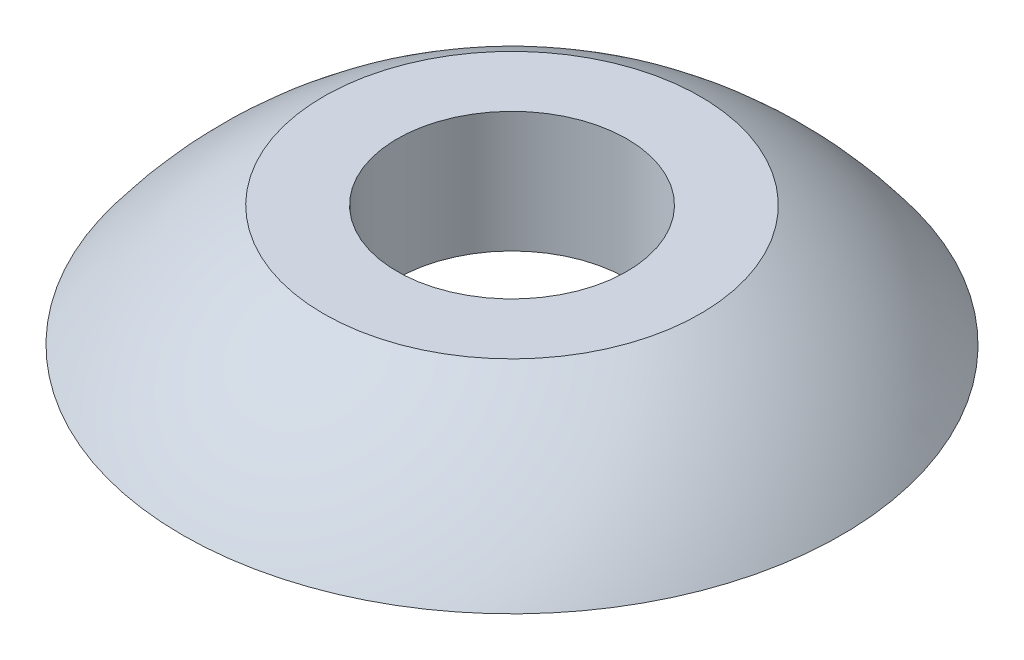
ISO-10303-21;
HEADER;
FILE_DESCRIPTION(('STEP AP214'),'2;1');
FILE_NAME('part.step','',(''),(''),'','','');
FILE_SCHEMA(('AUTOMOTIVE_DESIGN { 1 0 10303 214 1 1 1 1 }'));
ENDSEC;
DATA;
#1=APPLICATION_CONTEXT('core data for automotive mechanical design processes');
#2=APPLICATION_PROTOCOL_DEFINITION('international standard','automotive_design',2000,#1);
#3=PRODUCT_CONTEXT('',#1,'mechanical');
#4=PRODUCT('Part','Part','',(#3));
#5=PRODUCT_RELATED_PRODUCT_CATEGORY('part','',(#4));
#6=PRODUCT_DEFINITION_FORMATION('','',#4);
#7=PRODUCT_DEFINITION_CONTEXT('part definition',#1,'design');
#8=PRODUCT_DEFINITION('design','',#6,#7);
#9=PRODUCT_DEFINITION_SHAPE('','',#8);
#10=(LENGTH_UNIT() NAMED_UNIT(*) SI_UNIT(.MILLI.,.METRE.));
#11=(NAMED_UNIT(*) PLANE_ANGLE_UNIT() SI_UNIT($,.RADIAN.));
#12=(NAMED_UNIT(*) SI_UNIT($,.STERADIAN.) SOLID_ANGLE_UNIT());
#13=UNCERTAINTY_MEASURE_WITH_UNIT(LENGTH_MEASURE(1.E-05),#10,'distance_accuracy_value','');
#14=(GEOMETRIC_REPRESENTATION_CONTEXT(3) GLOBAL_UNCERTAINTY_ASSIGNED_CONTEXT((#13)) GLOBAL_UNIT_ASSIGNED_CONTEXT((#10,
#11,#12)) REPRESENTATION_CONTEXT('',''));
#15=CARTESIAN_POINT('',(0.,0.,0.));
#16=DIRECTION('',(0.,0.,1.));
#17=DIRECTION('',(1.,0.,0.));
#18=AXIS2_PLACEMENT_3D('',#15,#16,#17);
#19=CARTESIAN_POINT('',(0.,30.,0.));
#20=DIRECTION('',(0.,1.,0.));
#21=DIRECTION('',(0.,0.,1.));
#22=AXIS2_PLACEMENT_3D('',#19,#20,#21);
#23=PLANE('',#22);
#24=CARTESIAN_POINT('',(0.,30.,0.));
#25=DIRECTION('',(0.,-1.,0.));
#26=DIRECTION('',(0.,0.,-1.));
#27=AXIS2_PLACEMENT_3D('',#24,#25,#26);
#28=CIRCLE('',#27,9.5);
#29=CARTESIAN_POINT('',(0.,30.,-9.5));
#30=VERTEX_POINT('',#29);
#31=EDGE_CURVE('E64',#30,#30,#28,.T.);
#32=ORIENTED_EDGE('',*,*,#31,.T.);
#33=EDGE_LOOP('',(#32));
#34=FACE_BOUND('',#33,.T.);
#35=CARTESIAN_POINT('',(0.,30.,0.));
#36=DIRECTION('',(0.,-1.,0.));
#37=DIRECTION('',(0.,0.,-1.));
#38=AXIS2_PLACEMENT_3D('',#35,#36,#37);
#39=CIRCLE('',#38,15.5704848993215);
#40=CARTESIAN_POINT('',(0.,30.,15.5704848993215));
#41=VERTEX_POINT('',#40);
#42=EDGE_CURVE('E10',#41,#41,#39,.T.);
#43=ORIENTED_EDGE('',*,*,#42,.F.);
#44=EDGE_LOOP('',(#43));
#45=FACE_BOUND('',#44,.T.);
#46=ADVANCED_FACE('F36',(#34,#45),#23,.T.);
#47=CARTESIAN_POINT('',(0.,0.,0.));
#48=DIRECTION('',(0.,-1.,0.));
#49=DIRECTION('',(0.,0.,1.));
#50=AXIS2_PLACEMENT_3D('',#47,#48,#49);
#51=SPHERICAL_SURFACE('',#50,33.8);
#52=CARTESIAN_POINT('',(0.,20.,0.));
#53=DIRECTION('',(0.,-1.,0.));
#54=DIRECTION('',(0.,0.,-1.));
#55=AXIS2_PLACEMENT_3D('',#52,#53,#54);
#56=CIRCLE('',#55,27.2477522008697);
#57=CARTESIAN_POINT('',(0.,20.,27.2477522008697));
#58=VERTEX_POINT('',#57);
#59=EDGE_CURVE('E42',#58,#58,#56,.T.);
#60=CARTESIAN_POINT('',(0.,30.,15.5704848993215));
#61=CARTESIAN_POINT('',(0.,29.9255754316061,15.7138805582908));
#62=CARTESIAN_POINT('',(0.,29.8501225999215,15.8567425295986));
#63=CARTESIAN_POINT('',(0.,29.6971762554765,16.1413698995106));
#64=CARTESIAN_POINT('',(0.,29.6196827427161,16.2831352981148));
#65=CARTESIAN_POINT('',(0.,29.4626708816249,16.5655403252389));
#66=CARTESIAN_POINT('',(0.,29.3831525332941,16.7061799537588));
#67=CARTESIAN_POINT('',(0.,29.2221073753458,16.9863045352302));
#68=CARTESIAN_POINT('',(0.,29.1405805657283,17.1257894881816));
#69=CARTESIAN_POINT('',(0.,28.9755352423428,17.4035760342672));
#70=CARTESIAN_POINT('',(0.,28.8920167285748,17.5418776274014));
#71=CARTESIAN_POINT('',(0.,28.7230051716302,17.8172690172632));
#72=CARTESIAN_POINT('',(0.,28.6375121284536,17.9543588139909));
#73=CARTESIAN_POINT('',(0.,28.4645690912724,18.2272984224572));
#74=CARTESIAN_POINT('',(0.,28.3771190972678,18.3631482341958));
#75=CARTESIAN_POINT('',(0.,28.200280139978,18.6335799393779));
#76=CARTESIAN_POINT('',(0.,28.1108911766928,18.7681618328214));
#77=CARTESIAN_POINT('',(0.,27.930192660924,19.0360300287327));
#78=CARTESIAN_POINT('',(0.,27.8388831084404,19.1693163312005));
#79=CARTESIAN_POINT('',(0.,27.6543621893089,19.4345659389006));
#80=CARTESIAN_POINT('',(0.,27.5611508226611,19.566529244133));
#81=CARTESIAN_POINT('',(0.,27.3728454412745,19.8291057231309));
#82=CARTESIAN_POINT('',(0.,27.2777514265357,19.9597188968965));
#83=CARTESIAN_POINT('',(0.,27.0857003021527,20.2195682563441));
#84=CARTESIAN_POINT('',(0.,26.9887431925084,20.3488044420262));
#85=CARTESIAN_POINT('',(0.,26.7929858145877,20.6058732518256));
#86=CARTESIAN_POINT('',(0.,26.6941855463111,20.7337058759429));
#87=CARTESIAN_POINT('',(0.,26.4947621663887,20.9879412777312));
#88=CARTESIAN_POINT('',(0.,26.3941390547428,21.1143440554021));
#89=CARTESIAN_POINT('',(0.,26.1910906781567,21.3656937734203));
#90=CARTESIAN_POINT('',(0.,26.0886654132164,21.4906407137676));
#91=CARTESIAN_POINT('',(0.,25.8820337906742,21.7390530656096));
#92=CARTESIAN_POINT('',(0.,25.7778274330724,21.8625184771045));
#93=CARTESIAN_POINT('',(0.,25.5676550520675,22.1079423843442));
#94=CARTESIAN_POINT('',(0.,25.4616890286644,22.2299008800891));
#95=CARTESIAN_POINT('',(0.,25.2480191047388,22.4722858787828));
#96=CARTESIAN_POINT('',(0.,25.1403152042163,22.5927123817316));
#97=CARTESIAN_POINT('',(0.,24.9231916720752,22.8320086327944));
#98=CARTESIAN_POINT('',(0.,24.8137720404566,22.9508783809084));
#99=CARTESIAN_POINT('',(0.,24.5932395449346,23.1870366803622));
#100=CARTESIAN_POINT('',(0.,24.482126681031,23.304325231702));
#101=CARTESIAN_POINT('',(0.,24.2582305679118,23.5372970207929));
#102=CARTESIAN_POINT('',(0.,24.145447318696,23.6529802585439));
#103=CARTESIAN_POINT('',(0.,23.9182336253888,23.8827176337266));
#104=CARTESIAN_POINT('',(0.,23.8038031812975,23.9967717711583));
#105=CARTESIAN_POINT('',(0.,23.5733186273705,24.2232274939458));
#106=CARTESIAN_POINT('',(0.,23.457264517535,24.3356290793016));
#107=CARTESIAN_POINT('',(0.,23.2235564951107,24.5587565859804));
#108=CARTESIAN_POINT('',(0.,23.105902582522,24.6694825073035));
#109=CARTESIAN_POINT('',(0.,22.8690191465251,24.8892359184992));
#110=CARTESIAN_POINT('',(0.,22.749789623117,24.9982634083718));
#111=CARTESIAN_POINT('',(0.,22.5097794814203,25.2145975385172));
#112=CARTESIAN_POINT('',(0.,22.3889988631316,25.32190417879));
#113=CARTESIAN_POINT('',(0.,22.1459113664415,25.5347745452859));
#114=CARTESIAN_POINT('',(0.,22.02360448804,25.640338271509));
#115=CARTESIAN_POINT('',(0.,21.7774896201177,25.8497011043578));
#116=CARTESIAN_POINT('',(0.,21.6536816305969,25.9535002109834));
#117=CARTESIAN_POINT('',(0.,21.4045899966061,26.1593124599712));
#118=CARTESIAN_POINT('',(0.,21.279306352136,26.2613256023332));
#119=CARTESIAN_POINT('',(0.,21.027289173368,26.4635449526658));
#120=CARTESIAN_POINT('',(0.,20.9005556390701,26.5637511606362));
#121=CARTESIAN_POINT('',(0.,20.6456647232631,26.7623360163211));
#122=CARTESIAN_POINT('',(0.,20.5175073417541,26.8607146640355));
#123=CARTESIAN_POINT('',(0.,20.2597951439052,27.0556242509265));
#124=CARTESIAN_POINT('',(0.,20.1302403275653,27.152155190103));
#125=CARTESIAN_POINT('',(0.,20.,27.2477522008697));
#126=B_SPLINE_CURVE_WITH_KNOTS('',3,(#60,#61,#62,#63,#64,#65,#66,#67,#68,#69,#70,#71,#72,#73,
#74,#75,#76,#77,#78,#79,#80,#81,#82,#83,#84,#85,#86,#87,#88,#89,#90,#91,#92,#93,#94,#95,#96,#97,
#98,#99,#100,#101,#102,#103,#104,#105,#106,#107,#108,#109,#110,#111,#112,#113,#114,#115,#116,
#117,#118,#119,#120,#121,#122,#123,#124,#125),.UNSPECIFIED.,.F.,.F.,(4,2,2,2,2,2,2,2,2,2,2,2,2,
2,2,2,2,2,2,2,2,2,2,2,2,2,2,2,2,2,2,2,4),(0.,0.484673038059213,0.969346076118429,
1.45401911417764,1.93869215223685,2.42336519029607,2.90803822835528,3.39271126641449,
3.87738430447371,4.36205734253292,4.84673038059213,5.33140341865135,5.81607645671056,
6.30074949476977,6.78542253282899,7.2700955708882,7.75476860894741,8.23944164700663,
8.72411468506584,9.20878772312506,9.69346076118426,10.1781337992435,10.6628068373027,
11.1474798753619,11.6321529134211,12.1168259514803,12.6014989895395,13.0861720275988,
13.570845065658,14.0555181037172,14.5401911417764,15.0248641798356,15.5095372178948),.UNSPECIFIED.);
#127=EDGE_CURVE('BSEAM82',#41,#58,#126,.T.);
#128=ORIENTED_EDGE('',*,*,#42,.T.);
#129=ORIENTED_EDGE('',*,*,#59,.F.);
#130=ORIENTED_EDGE('',*,*,#127,.T.);
#131=ORIENTED_EDGE('',*,*,#127,.F.);
#132=EDGE_LOOP('',(#128,#130,#129,#131));
#133=FACE_BOUND('',#132,.T.);
#134=ADVANCED_FACE('F82',(#133),#51,.T.);
#135=CARTESIAN_POINT('',(0.,20.,0.));
#136=DIRECTION('',(0.,1.,0.));
#137=DIRECTION('',(0.,0.,1.));
#138=AXIS2_PLACEMENT_3D('',#135,#136,#137);
#139=PLANE('',#138);
#140=CARTESIAN_POINT('',(0.,20.,0.));
#141=DIRECTION('',(0.,-1.,0.));
#142=DIRECTION('',(0.,0.,-1.));
#143=AXIS2_PLACEMENT_3D('',#140,#141,#142);
#144=CIRCLE('',#143,24.7232683923465);
#145=CARTESIAN_POINT('',(0.,20.,24.7232683923465));
#146=VERTEX_POINT('',#145);
#147=EDGE_CURVE('E46',#146,#146,#144,.T.);
#148=ORIENTED_EDGE('',*,*,#147,.F.);
#149=EDGE_LOOP('',(#148));
#150=FACE_BOUND('',#149,.T.);
#151=ORIENTED_EDGE('',*,*,#59,.T.);
#152=EDGE_LOOP('',(#151));
#153=FACE_BOUND('',#152,.T.);
#154=ADVANCED_FACE('F86',(#150,#153),#139,.F.);
#155=CARTESIAN_POINT('',(0.,0.,0.));
#156=DIRECTION('',(0.,-1.,0.));
#157=DIRECTION('',(0.,0.,1.));
#158=AXIS2_PLACEMENT_3D('',#155,#156,#157);
#159=SPHERICAL_SURFACE('',#158,31.8);
#160=CARTESIAN_POINT('',(0.,28.,0.));
#161=DIRECTION('',(0.,-1.,0.));
#162=DIRECTION('',(0.,0.,-1.));
#163=AXIS2_PLACEMENT_3D('',#160,#161,#162);
#164=CIRCLE('',#163,15.074481748969);
#165=CARTESIAN_POINT('',(0.,28.,15.074481748969));
#166=VERTEX_POINT('',#165);
#167=EDGE_CURVE('E50',#166,#166,#164,.T.);
#168=CARTESIAN_POINT('',(0.,28.,15.074481748969));
#169=CARTESIAN_POINT('',(0.,27.9377007660176,15.1901991587355));
#170=CARTESIAN_POINT('',(0.,27.8746841057629,15.3055303235035));
#171=CARTESIAN_POINT('',(0.,27.7472257921112,15.5354025306236));
#172=CARTESIAN_POINT('',(0.,27.6827841387142,15.6499435729758));
#173=CARTESIAN_POINT('',(0.,27.5524856981802,15.8782179028456));
#174=CARTESIAN_POINT('',(0.,27.4866289110431,15.9919511903632));
#175=CARTESIAN_POINT('',(0.,27.3535103386518,16.2185925348533));
#176=CARTESIAN_POINT('',(0.,27.2862485533976,16.3315005918257));
#177=CARTESIAN_POINT('',(0.,27.1503303206387,16.5564741176456));
#178=CARTESIAN_POINT('',(0.,27.081673873134,16.6685395864931));
#179=CARTESIAN_POINT('',(0.,26.9429768703361,16.8918107103388));
#180=CARTESIAN_POINT('',(0.,26.872936315043,17.0030163653371));
#181=CARTESIAN_POINT('',(0.,26.7314818627599,17.2245507673008));
#182=CARTESIAN_POINT('',(0.,26.6600679657701,17.3348795142663));
#183=CARTESIAN_POINT('',(0.,26.5158778075925,17.5546431409434));
#184=CARTESIAN_POINT('',(0.,26.4431015464047,17.664078020655));
#185=CARTESIAN_POINT('',(0.,26.2961978466652,17.8820370909594));
#186=CARTESIAN_POINT('',(0.,26.2220704081136,17.9905612815522));
#187=CARTESIAN_POINT('',(0.,26.0724757481996,18.2066822917536));
#188=CARTESIAN_POINT('',(0.,25.9970085268373,18.3142791113621));
#189=CARTESIAN_POINT('',(0.,25.8447459017948,18.5285288402776));
#190=CARTESIAN_POINT('',(0.,25.7679504981146,18.6351817495846));
#191=CARTESIAN_POINT('',(0.,25.6130433130932,18.8475272636741));
#192=CARTESIAN_POINT('',(0.,25.5349315317521,18.9532198684568));
#193=CARTESIAN_POINT('',(0.,25.377403598413,19.1636285268888));
#194=CARTESIAN_POINT('',(0.,25.2979874464152,19.2683445805381));
#195=CARTESIAN_POINT('',(0.,25.1378629792694,19.4767840402056));
#196=CARTESIAN_POINT('',(0.,25.0571546641215,19.5805074462238));
#197=CARTESIAN_POINT('',(0.,24.8944582768079,19.7869456667168));
#198=CARTESIAN_POINT('',(0.,24.8124702046422,19.8896604811916));
#199=CARTESIAN_POINT('',(0.,24.6472269061441,20.0940657297217));
#200=CARTESIAN_POINT('',(0.,24.5639716798117,20.1957561637771));
#201=CARTESIAN_POINT('',(0.,24.3962068706125,20.3980970200558));
#202=CARTESIAN_POINT('',(0.,24.3116972877458,20.4987474422791));
#203=CARTESIAN_POINT('',(0.,24.1414367559248,20.698992803347));
#204=CARTESIAN_POINT('',(0.,24.0556858069705,20.7985877421917));
#205=CARTESIAN_POINT('',(0.,23.8829557242385,20.9967068272002));
#206=CARTESIAN_POINT('',(0.,23.7959765904608,21.095230973364));
#207=CARTESIAN_POINT('',(0.,23.6208035081372,21.2911933283061));
#208=CARTESIAN_POINT('',(0.,23.5326095595913,21.3886315370844));
#209=CARTESIAN_POINT('',(0.,23.355020404523,21.5824070394765));
#210=CARTESIAN_POINT('',(0.,23.2656251980005,21.6787443330903));
#211=CARTESIAN_POINT('',(0.,23.0856472684224,21.8703031966023));
#212=CARTESIAN_POINT('',(0.,22.9950645453669,21.9655247665005));
#213=CARTESIAN_POINT('',(0.,22.812725506706,22.1548375455341));
#214=CARTESIAN_POINT('',(0.,22.7209691911007,22.2489287546696));
#215=CARTESIAN_POINT('',(0.,22.5362970717243,22.435966348886));
#216=CARTESIAN_POINT('',(0.,22.4433812679531,22.5289127339669));
#217=CARTESIAN_POINT('',(0.,22.2564044548562,22.713646392755));
#218=CARTESIAN_POINT('',(0.,22.1623434455305,22.8054336664621));
#219=CARTESIAN_POINT('',(0.,21.9730906799874,22.9878349933757));
#220=CARTESIAN_POINT('',(0.,21.87789892377,23.0784490465822));
#221=CARTESIAN_POINT('',(0.,21.6863992968612,23.2584900036389));
#222=CARTESIAN_POINT('',(0.,21.5900914261697,23.3479169074892));
#223=CARTESIAN_POINT('',(0.,21.3963743745152,23.5255698197274));
#224=CARTESIAN_POINT('',(0.,21.2989651935521,23.6137958281153));
#225=CARTESIAN_POINT('',(0.,21.1030604940213,23.7890333869259));
#226=CARTESIAN_POINT('',(0.,21.0045649754535,23.8760449373484));
#227=CARTESIAN_POINT('',(0.,20.8065027434437,24.0488402081143));
#228=CARTESIAN_POINT('',(0.,20.7069360300017,24.1346239284577));
#229=CARTESIAN_POINT('',(0.,20.5067467041515,24.304950341849));
#230=CARTESIAN_POINT('',(0.,20.4061240917432,24.3894930348969));
#231=CARTESIAN_POINT('',(0.,20.2038384690284,24.5573244388953));
#232=CARTESIAN_POINT('',(0.,20.1021754587218,24.6406131498458));
#233=CARTESIAN_POINT('',(0.,20.,24.7232683923465));
#234=B_SPLINE_CURVE_WITH_KNOTS('',3,(#168,#169,#170,#171,#172,#173,#174,#175,#176,#177,#178,
#179,#180,#181,#182,#183,#184,#185,#186,#187,#188,#189,#190,#191,#192,#193,#194,#195,#196,#197,
#198,#199,#200,#201,#202,#203,#204,#205,#206,#207,#208,#209,#210,#211,#212,#213,#214,#215,#216,
#217,#218,#219,#220,#221,#222,#223,#224,#225,#226,#227,#228,#229,#230,#231,#232,#233),
.UNSPECIFIED.,.F.,.F.,(4,2,2,2,2,2,2,2,2,2,2,2,2,2,2,2,2,2,2,2,2,2,2,2,2,2,2,2,2,2,2,2,4),(0.,
0.394263146651515,0.788526293303023,1.18278943995454,1.57705258660605,1.97131573325756,
2.36557887990908,2.75984202656059,3.1541051732121,3.54836831986361,3.94263146651513,
4.33689461316664,4.73115775981815,5.12542090646967,5.51968405312117,5.91394719977269,
6.3082103464242,6.70247349307572,7.09673663972723,7.49099978637874,7.88526293303025,
8.27952607968177,8.67378922633328,9.06805237298479,9.4623155196363,9.85657866628781,
10.2508418129393,10.6451049595908,11.0393681062424,11.4336312528939,11.8278943995454,
12.2221575461969,12.6164206928484),.UNSPECIFIED.);
#235=EDGE_CURVE('BSEAM90',#166,#146,#234,.T.);
#236=ORIENTED_EDGE('',*,*,#167,.F.);
#237=ORIENTED_EDGE('',*,*,#147,.T.);
#238=ORIENTED_EDGE('',*,*,#235,.T.);
#239=ORIENTED_EDGE('',*,*,#235,.F.);
#240=EDGE_LOOP('',(#236,#238,#237,#239));
#241=FACE_BOUND('',#240,.T.);
#242=ADVANCED_FACE('F90',(#241),#159,.F.);
#243=CARTESIAN_POINT('',(0.,28.,0.));
#244=DIRECTION('',(0.,-1.,0.));
#245=DIRECTION('',(0.,0.,-1.));
#246=AXIS2_PLACEMENT_3D('',#243,#244,#245);
#247=PLANE('',#246);
#248=ORIENTED_EDGE('',*,*,#167,.T.);
#249=EDGE_LOOP('',(#248));
#250=FACE_BOUND('',#249,.T.);
#251=CARTESIAN_POINT('',(0.,28.,0.));
#252=DIRECTION('',(0.,-1.,0.));
#253=DIRECTION('',(0.,0.,-1.));
#254=AXIS2_PLACEMENT_3D('',#251,#252,#253);
#255=CIRCLE('',#254,11.5);
#256=CARTESIAN_POINT('',(0.,28.,-11.5));
#257=VERTEX_POINT('',#256);
#258=EDGE_CURVE('E55',#257,#257,#255,.T.);
#259=ORIENTED_EDGE('',*,*,#258,.F.);
#260=EDGE_LOOP('',(#259));
#261=FACE_BOUND('',#260,.T.);
#262=ADVANCED_FACE('F97',(#250,#261),#247,.T.);
#263=CARTESIAN_POINT('',(0.,0.,0.));
#264=DIRECTION('',(0.,-1.,0.));
#265=DIRECTION('',(0.,0.,-1.));
#266=AXIS2_PLACEMENT_3D('',#263,#264,#265);
#267=CYLINDRICAL_SURFACE('',#266,11.5);
#268=ORIENTED_EDGE('',*,*,#258,.T.);
#269=EDGE_LOOP('',(#268));
#270=FACE_BOUND('',#269,.T.);
#271=CARTESIAN_POINT('',(0.,20.,0.));
#272=DIRECTION('',(0.,-1.,0.));
#273=DIRECTION('',(0.,0.,-1.));
#274=AXIS2_PLACEMENT_3D('',#271,#272,#273);
#275=CIRCLE('',#274,11.5);
#276=CARTESIAN_POINT('',(0.,20.,-11.5));
#277=VERTEX_POINT('',#276);
#278=EDGE_CURVE('E58',#277,#277,#275,.T.);
#279=ORIENTED_EDGE('',*,*,#278,.F.);
#280=EDGE_LOOP('',(#279));
#281=FACE_BOUND('',#280,.T.);
#282=ADVANCED_FACE('F78',(#270,#281),#267,.T.);
#283=CARTESIAN_POINT('',(0.,20.,0.));
#284=DIRECTION('',(0.,1.,0.));
#285=DIRECTION('',(0.,0.,1.));
#286=AXIS2_PLACEMENT_3D('',#283,#284,#285);
#287=PLANE('',#286);
#288=CARTESIAN_POINT('',(0.,20.,0.));
#289=DIRECTION('',(0.,-1.,0.));
#290=DIRECTION('',(0.,0.,-1.));
#291=AXIS2_PLACEMENT_3D('',#288,#289,#290);
#292=CIRCLE('',#291,9.5);
#293=CARTESIAN_POINT('',(0.,20.,-9.5));
#294=VERTEX_POINT('',#293);
#295=EDGE_CURVE('E61',#294,#294,#292,.T.);
#296=ORIENTED_EDGE('',*,*,#295,.F.);
#297=EDGE_LOOP('',(#296));
#298=FACE_BOUND('',#297,.T.);
#299=ORIENTED_EDGE('',*,*,#278,.T.);
#300=EDGE_LOOP('',(#299));
#301=FACE_BOUND('',#300,.T.);
#302=ADVANCED_FACE('F72',(#298,#301),#287,.F.);
#303=CARTESIAN_POINT('',(0.,0.,0.));
#304=DIRECTION('',(0.,-1.,0.));
#305=DIRECTION('',(0.,0.,-1.));
#306=AXIS2_PLACEMENT_3D('',#303,#304,#305);
#307=CYLINDRICAL_SURFACE('',#306,9.5);
#308=ORIENTED_EDGE('',*,*,#295,.T.);
#309=EDGE_LOOP('',(#308));
#310=FACE_BOUND('',#309,.T.);
#311=ORIENTED_EDGE('',*,*,#31,.F.);
#312=EDGE_LOOP('',(#311));
#313=FACE_BOUND('',#312,.T.);
#314=ADVANCED_FACE('F70',(#310,#313),#307,.F.);
#315=CLOSED_SHELL('',(#46,#134,#154,#242,#262,#282,#302,#314));
#316=MANIFOLD_SOLID_BREP('B2',#315);
#317=ADVANCED_BREP_SHAPE_REPRESENTATION('',(#18,#316),#14);
#318=SHAPE_DEFINITION_REPRESENTATION(#9,#317);
ENDSEC;
END-ISO-10303-21;
